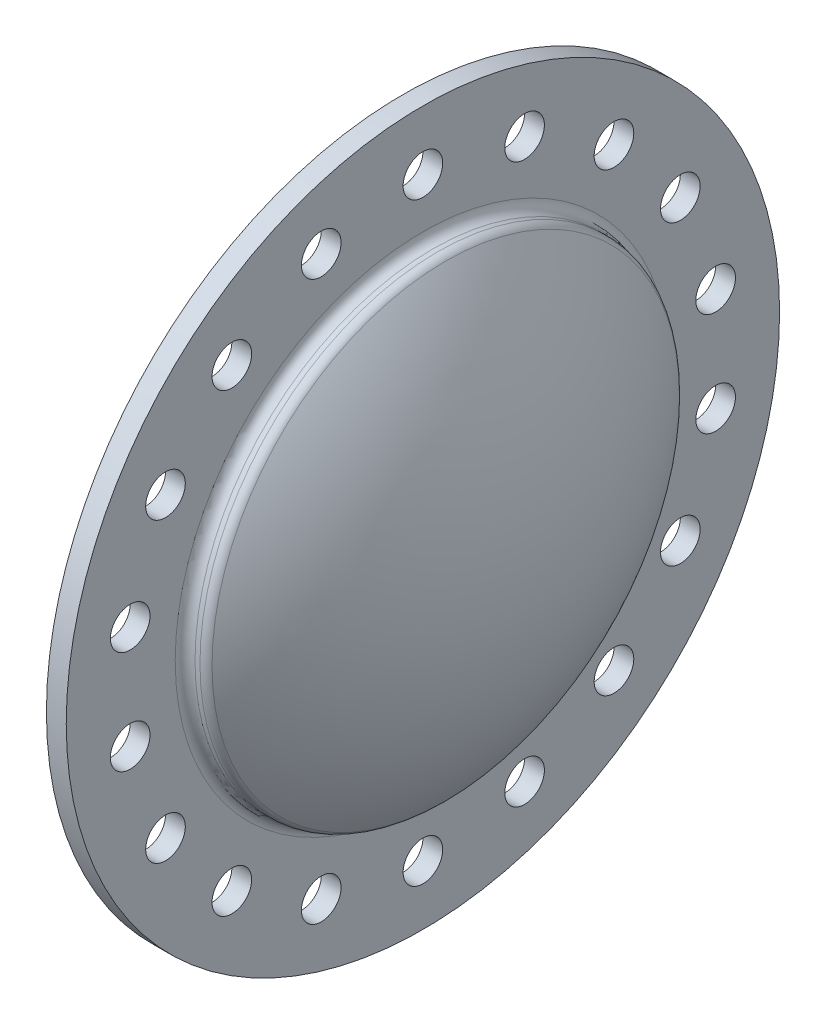
ISO-10303-21;
HEADER;
FILE_DESCRIPTION(('STEP AP214'),'2;1');
FILE_NAME('part.step','',(''),(''),'','','');
FILE_SCHEMA(('AUTOMOTIVE_DESIGN { 1 0 10303 214 1 1 1 1 }'));
ENDSEC;
DATA;
#1=APPLICATION_CONTEXT('core data for automotive mechanical design processes');
#2=APPLICATION_PROTOCOL_DEFINITION('international standard','automotive_design',2000,#1);
#3=PRODUCT_CONTEXT('',#1,'mechanical');
#4=PRODUCT('Part','Part','',(#3));
#5=PRODUCT_RELATED_PRODUCT_CATEGORY('part','',(#4));
#6=PRODUCT_DEFINITION_FORMATION('','',#4);
#7=PRODUCT_DEFINITION_CONTEXT('part definition',#1,'design');
#8=PRODUCT_DEFINITION('design','',#6,#7);
#9=PRODUCT_DEFINITION_SHAPE('','',#8);
#10=(LENGTH_UNIT() NAMED_UNIT(*) SI_UNIT(.MILLI.,.METRE.));
#11=(NAMED_UNIT(*) PLANE_ANGLE_UNIT() SI_UNIT($,.RADIAN.));
#12=(NAMED_UNIT(*) SI_UNIT($,.STERADIAN.) SOLID_ANGLE_UNIT());
#13=UNCERTAINTY_MEASURE_WITH_UNIT(LENGTH_MEASURE(1.E-05),#10,'distance_accuracy_value','');
#14=(GEOMETRIC_REPRESENTATION_CONTEXT(3) GLOBAL_UNCERTAINTY_ASSIGNED_CONTEXT((#13)) GLOBAL_UNIT_ASSIGNED_CONTEXT((#10,
#11,#12)) REPRESENTATION_CONTEXT('',''));
#15=CARTESIAN_POINT('',(0.,0.,0.));
#16=DIRECTION('',(0.,0.,1.));
#17=DIRECTION('',(1.,0.,0.));
#18=AXIS2_PLACEMENT_3D('',#15,#16,#17);
#19=CARTESIAN_POINT('',(5.,0.,0.));
#20=DIRECTION('',(1.,0.,0.));
#21=DIRECTION('',(0.,0.,-1.));
#22=AXIS2_PLACEMENT_3D('',#19,#20,#21);
#23=PLANE('',#22);
#24=CARTESIAN_POINT('',(5.,0.,0.));
#25=DIRECTION('',(1.,0.,0.));
#26=DIRECTION('',(0.,0.,-1.));
#27=AXIS2_PLACEMENT_3D('',#24,#25,#26);
#28=CIRCLE('',#27,62.5);
#29=CARTESIAN_POINT('',(5.,0.,-62.5));
#30=VERTEX_POINT('',#29);
#31=EDGE_CURVE('E10',#30,#30,#28,.F.);
#32=ORIENTED_EDGE('',*,*,#31,.T.);
#33=EDGE_LOOP('',(#32));
#34=FACE_BOUND('',#33,.T.);
#35=CARTESIAN_POINT('',(5.,57.4526904463122,48.2088367709321));
#36=DIRECTION('',(1.,0.,0.));
#37=DIRECTION('',(0.,0.,-1.));
#38=AXIS2_PLACEMENT_3D('',#35,#36,#37);
#39=CIRCLE('',#38,5.);
#40=CARTESIAN_POINT('',(5.,57.4526904463122,43.2088367709321));
#41=VERTEX_POINT('',#40);
#42=EDGE_CURVE('E151',#41,#41,#39,.T.);
#43=ORIENTED_EDGE('',*,*,#42,.F.);
#44=EDGE_LOOP('',(#43));
#45=FACE_BOUND('',#44,.T.);
#46=CARTESIAN_POINT('',(5.,13.0226285172644,73.8597551240905));
#47=DIRECTION('',(1.,0.,0.));
#48=DIRECTION('',(0.,0.,-1.));
#49=AXIS2_PLACEMENT_3D('',#46,#47,#48);
#50=CIRCLE('',#49,5.);
#51=CARTESIAN_POINT('',(5.,13.0226285172644,68.8597551240905));
#52=VERTEX_POINT('',#51);
#53=EDGE_CURVE('E139',#52,#52,#50,.T.);
#54=ORIENTED_EDGE('',*,*,#53,.F.);
#55=EDGE_LOOP('',(#54));
#56=FACE_BOUND('',#55,.T.);
#57=CARTESIAN_POINT('',(5.,-37.5008660254059,64.9504052838285));
#58=DIRECTION('',(1.,0.,0.));
#59=DIRECTION('',(0.,0.,-1.));
#60=AXIS2_PLACEMENT_3D('',#57,#58,#59);
#61=CIRCLE('',#60,5.00000000000001);
#62=CARTESIAN_POINT('',(5.,-37.5008660254059,59.9504052838285));
#63=VERTEX_POINT('',#62);
#64=EDGE_CURVE('E127',#63,#63,#61,.T.);
#65=ORIENTED_EDGE('',*,*,#64,.F.);
#66=EDGE_LOOP('',(#65));
#67=FACE_BOUND('',#66,.T.);
#68=CARTESIAN_POINT('',(5.,-70.4772885790873,25.6495710567987));
#69=DIRECTION('',(1.,0.,0.));
#70=DIRECTION('',(0.,0.,-1.));
#71=AXIS2_PLACEMENT_3D('',#68,#69,#70);
#72=CIRCLE('',#71,5.);
#73=CARTESIAN_POINT('',(5.,-70.4772885790873,20.6495710567987));
#74=VERTEX_POINT('',#73);
#75=EDGE_CURVE('E115',#74,#74,#72,.T.);
#76=ORIENTED_EDGE('',*,*,#75,.F.);
#77=EDGE_LOOP('',(#76));
#78=FACE_BOUND('',#77,.T.);
#79=CARTESIAN_POINT('',(5.,-70.4766045387989,-25.6534504420517));
#80=DIRECTION('',(1.,0.,0.));
#81=DIRECTION('',(0.,0.,-1.));
#82=AXIS2_PLACEMENT_3D('',#79,#80,#81);
#83=CIRCLE('',#82,5.);
#84=CARTESIAN_POINT('',(5.,-70.4766045387989,-30.6534504420517));
#85=VERTEX_POINT('',#84);
#86=EDGE_CURVE('E103',#85,#85,#83,.T.);
#87=ORIENTED_EDGE('',*,*,#86,.F.);
#88=EDGE_LOOP('',(#87));
#89=FACE_BOUND('',#88,.T.);
#90=CARTESIAN_POINT('',(5.,-37.4991339745938,-64.9534052838375));
#91=DIRECTION('',(1.,0.,0.));
#92=DIRECTION('',(0.,0.,-1.));
#93=AXIS2_PLACEMENT_3D('',#90,#91,#92);
#94=CIRCLE('',#93,5.);
#95=CARTESIAN_POINT('',(5.,-37.4991339745938,-69.9534052838375));
#96=VERTEX_POINT('',#95);
#97=EDGE_CURVE('E91',#96,#96,#94,.T.);
#98=ORIENTED_EDGE('',*,*,#97,.F.);
#99=EDGE_LOOP('',(#98));
#100=FACE_BOUND('',#99,.T.);
#101=CARTESIAN_POINT('',(5.,13.0245981327757,-73.8614078277406));
#102=DIRECTION('',(1.,0.,0.));
#103=DIRECTION('',(0.,0.,-1.));
#104=AXIS2_PLACEMENT_3D('',#101,#102,#103);
#105=CIRCLE('',#104,5.);
#106=CARTESIAN_POINT('',(5.,13.0245981327757,-78.8614078277406));
#107=VERTEX_POINT('',#106);
#108=EDGE_CURVE('E79',#107,#107,#105,.T.);
#109=ORIENTED_EDGE('',*,*,#108,.F.);
#110=EDGE_LOOP('',(#109));
#111=FACE_BOUND('',#110,.T.);
#112=CARTESIAN_POINT('',(5.,57.453976021535,-48.2093046820482));
#113=DIRECTION('',(1.,0.,0.));
#114=DIRECTION('',(0.,0.,-1.));
#115=AXIS2_PLACEMENT_3D('',#112,#113,#114);
#116=CIRCLE('',#115,5.00000000000001);
#117=CARTESIAN_POINT('',(5.,57.453976021535,-53.2093046820482));
#118=VERTEX_POINT('',#117);
#119=EDGE_CURVE('E67',#118,#118,#116,.T.);
#120=ORIENTED_EDGE('',*,*,#119,.F.);
#121=EDGE_LOOP('',(#120));
#122=FACE_BOUND('',#121,.T.);
#123=CARTESIAN_POINT('',(5.,0.,0.));
#124=DIRECTION('',(1.,0.,0.));
#125=DIRECTION('',(0.,0.,-1.));
#126=AXIS2_PLACEMENT_3D('',#123,#124,#125);
#127=CIRCLE('',#126,90.);
#128=CARTESIAN_POINT('',(5.,0.,-90.));
#129=VERTEX_POINT('',#128);
#130=EDGE_CURVE('E51',#129,#129,#127,.T.);
#131=ORIENTED_EDGE('',*,*,#130,.T.);
#132=EDGE_LOOP('',(#131));
#133=FACE_BOUND('',#132,.T.);
#134=CARTESIAN_POINT('',(5.,75.,0.));
#135=DIRECTION('',(1.,0.,0.));
#136=DIRECTION('',(0.,0.,-1.));
#137=AXIS2_PLACEMENT_3D('',#134,#135,#136);
#138=CIRCLE('',#137,5.);
#139=CARTESIAN_POINT('',(5.,75.,-5.));
#140=VERTEX_POINT('',#139);
#141=EDGE_CURVE('E55',#140,#140,#138,.T.);
#142=ORIENTED_EDGE('',*,*,#141,.F.);
#143=EDGE_LOOP('',(#142));
#144=FACE_BOUND('',#143,.T.);
#145=CARTESIAN_POINT('',(5.,70.4772885790875,-25.6515710568046));
#146=DIRECTION('',(1.,0.,0.));
#147=DIRECTION('',(0.,0.,-1.));
#148=AXIS2_PLACEMENT_3D('',#145,#146,#147);
#149=CIRCLE('',#148,5.);
#150=CARTESIAN_POINT('',(5.,70.4772885790875,-30.6515710568046));
#151=VERTEX_POINT('',#150);
#152=EDGE_CURVE('E61',#151,#151,#149,.T.);
#153=ORIENTED_EDGE('',*,*,#152,.F.);
#154=EDGE_LOOP('',(#153));
#155=FACE_BOUND('',#154,.T.);
#156=CARTESIAN_POINT('',(5.,37.5008660254064,-64.9524052838346));
#157=DIRECTION('',(1.,0.,0.));
#158=DIRECTION('',(0.,0.,-1.));
#159=AXIS2_PLACEMENT_3D('',#156,#157,#158);
#160=CIRCLE('',#159,5.00000000000001);
#161=CARTESIAN_POINT('',(5.,37.5008660254064,-69.9524052838346));
#162=VERTEX_POINT('',#161);
#163=EDGE_CURVE('E73',#162,#162,#160,.T.);
#164=ORIENTED_EDGE('',*,*,#163,.F.);
#165=EDGE_LOOP('',(#164));
#166=FACE_BOUND('',#165,.T.);
#167=CARTESIAN_POINT('',(5.,-13.0226285172639,-73.861755124097));
#168=DIRECTION('',(1.,0.,0.));
#169=DIRECTION('',(0.,0.,-1.));
#170=AXIS2_PLACEMENT_3D('',#167,#168,#169);
#171=CIRCLE('',#170,5.);
#172=CARTESIAN_POINT('',(5.,-13.0226285172639,-78.861755124097));
#173=VERTEX_POINT('',#172);
#174=EDGE_CURVE('E85',#173,#173,#171,.T.);
#175=ORIENTED_EDGE('',*,*,#174,.F.);
#176=EDGE_LOOP('',(#175));
#177=FACE_BOUND('',#176,.T.);
#178=CARTESIAN_POINT('',(5.,-57.4526904463119,-48.2108367709389));
#179=DIRECTION('',(1.,0.,0.));
#180=DIRECTION('',(0.,0.,-1.));
#181=AXIS2_PLACEMENT_3D('',#178,#179,#180);
#182=CIRCLE('',#181,5.);
#183=CARTESIAN_POINT('',(5.,-57.4526904463119,-53.2108367709389));
#184=VERTEX_POINT('',#183);
#185=EDGE_CURVE('E97',#184,#184,#182,.T.);
#186=ORIENTED_EDGE('',*,*,#185,.F.);
#187=EDGE_LOOP('',(#186));
#188=FACE_BOUND('',#187,.T.);
#189=CARTESIAN_POINT('',(5.,-75.,-0.002000000005842));
#190=DIRECTION('',(1.,0.,0.));
#191=DIRECTION('',(0.,0.,-1.));
#192=AXIS2_PLACEMENT_3D('',#189,#190,#191);
#193=CIRCLE('',#192,5.);
#194=CARTESIAN_POINT('',(5.,-75.,-5.00200000000584));
#195=VERTEX_POINT('',#194);
#196=EDGE_CURVE('E109',#195,#195,#193,.T.);
#197=ORIENTED_EDGE('',*,*,#196,.F.);
#198=EDGE_LOOP('',(#197));
#199=FACE_BOUND('',#198,.T.);
#200=CARTESIAN_POINT('',(5.,-57.4539760215347,48.2073046820422));
#201=DIRECTION('',(1.,0.,0.));
#202=DIRECTION('',(0.,0.,-1.));
#203=AXIS2_PLACEMENT_3D('',#200,#201,#202);
#204=CIRCLE('',#203,5.);
#205=CARTESIAN_POINT('',(5.,-57.4539760215347,43.2073046820422));
#206=VERTEX_POINT('',#205);
#207=EDGE_CURVE('E121',#206,#206,#204,.T.);
#208=ORIENTED_EDGE('',*,*,#207,.F.);
#209=EDGE_LOOP('',(#208));
#210=FACE_BOUND('',#209,.T.);
#211=CARTESIAN_POINT('',(5.,-13.0245981327752,73.8594078277343));
#212=DIRECTION('',(1.,0.,0.));
#213=DIRECTION('',(0.,0.,-1.));
#214=AXIS2_PLACEMENT_3D('',#211,#212,#213);
#215=CIRCLE('',#214,5.);
#216=CARTESIAN_POINT('',(5.,-13.0245981327752,68.8594078277343));
#217=VERTEX_POINT('',#216);
#218=EDGE_CURVE('E133',#217,#217,#215,.T.);
#219=ORIENTED_EDGE('',*,*,#218,.F.);
#220=EDGE_LOOP('',(#219));
#221=FACE_BOUND('',#220,.T.);
#222=CARTESIAN_POINT('',(5.,37.4991339745942,64.9514052838309));
#223=DIRECTION('',(1.,0.,0.));
#224=DIRECTION('',(0.,0.,-1.));
#225=AXIS2_PLACEMENT_3D('',#222,#223,#224);
#226=CIRCLE('',#225,5.00000000000001);
#227=CARTESIAN_POINT('',(5.,37.4991339745942,59.9514052838309));
#228=VERTEX_POINT('',#227);
#229=EDGE_CURVE('E145',#228,#228,#226,.T.);
#230=ORIENTED_EDGE('',*,*,#229,.F.);
#231=EDGE_LOOP('',(#230));
#232=FACE_BOUND('',#231,.T.);
#233=CARTESIAN_POINT('',(5.,70.4766045387991,25.6514504420449));
#234=DIRECTION('',(1.,0.,0.));
#235=DIRECTION('',(0.,0.,-1.));
#236=AXIS2_PLACEMENT_3D('',#233,#234,#235);
#237=CIRCLE('',#236,5.00000000000001);
#238=CARTESIAN_POINT('',(5.,70.4766045387991,20.6514504420449));
#239=VERTEX_POINT('',#238);
#240=EDGE_CURVE('E157',#239,#239,#237,.T.);
#241=ORIENTED_EDGE('',*,*,#240,.F.);
#242=EDGE_LOOP('',(#241));
#243=FACE_BOUND('',#242,.T.);
#244=ADVANCED_FACE('F31',(#34,#45,#56,#67,#78,#89,#100,#111,#122,#133,#144,#155,#166,#177,#188,
#199,#210,#221,#232,#243),#23,.T.);
#245=CARTESIAN_POINT('',(0.,0.,0.));
#246=DIRECTION('',(1.,0.,0.));
#247=DIRECTION('',(0.,0.,-1.));
#248=AXIS2_PLACEMENT_3D('',#245,#246,#247);
#249=PLANE('',#248);
#250=CARTESIAN_POINT('',(0.,0.,0.));
#251=DIRECTION('',(1.,0.,0.));
#252=DIRECTION('',(0.,0.,-1.));
#253=AXIS2_PLACEMENT_3D('',#250,#251,#252);
#254=CIRCLE('',#253,90.);
#255=CARTESIAN_POINT('',(0.,0.,-90.));
#256=VERTEX_POINT('',#255);
#257=EDGE_CURVE('E52',#256,#256,#254,.T.);
#258=ORIENTED_EDGE('',*,*,#257,.F.);
#259=EDGE_LOOP('',(#258));
#260=FACE_BOUND('',#259,.T.);
#261=CARTESIAN_POINT('',(0.,75.,0.));
#262=DIRECTION('',(1.,0.,0.));
#263=DIRECTION('',(0.,0.,-1.));
#264=AXIS2_PLACEMENT_3D('',#261,#262,#263);
#265=CIRCLE('',#264,5.);
#266=CARTESIAN_POINT('',(0.,75.,-5.));
#267=VERTEX_POINT('',#266);
#268=EDGE_CURVE('E58',#267,#267,#265,.T.);
#269=ORIENTED_EDGE('',*,*,#268,.T.);
#270=EDGE_LOOP('',(#269));
#271=FACE_BOUND('',#270,.T.);
#272=CARTESIAN_POINT('',(0.,70.4772885790875,-25.6515710568046));
#273=DIRECTION('',(1.,0.,0.));
#274=DIRECTION('',(0.,0.,-1.));
#275=AXIS2_PLACEMENT_3D('',#272,#273,#274);
#276=CIRCLE('',#275,5.);
#277=CARTESIAN_POINT('',(0.,70.4772885790875,-30.6515710568046));
#278=VERTEX_POINT('',#277);
#279=EDGE_CURVE('E64',#278,#278,#276,.T.);
#280=ORIENTED_EDGE('',*,*,#279,.T.);
#281=EDGE_LOOP('',(#280));
#282=FACE_BOUND('',#281,.T.);
#283=CARTESIAN_POINT('',(0.,57.453976021535,-48.2093046820482));
#284=DIRECTION('',(1.,0.,0.));
#285=DIRECTION('',(0.,0.,-1.));
#286=AXIS2_PLACEMENT_3D('',#283,#284,#285);
#287=CIRCLE('',#286,5.00000000000001);
#288=CARTESIAN_POINT('',(0.,57.453976021535,-53.2093046820482));
#289=VERTEX_POINT('',#288);
#290=EDGE_CURVE('E70',#289,#289,#287,.T.);
#291=ORIENTED_EDGE('',*,*,#290,.T.);
#292=EDGE_LOOP('',(#291));
#293=FACE_BOUND('',#292,.T.);
#294=CARTESIAN_POINT('',(0.,37.5008660254064,-64.9524052838346));
#295=DIRECTION('',(1.,0.,0.));
#296=DIRECTION('',(0.,0.,-1.));
#297=AXIS2_PLACEMENT_3D('',#294,#295,#296);
#298=CIRCLE('',#297,5.00000000000001);
#299=CARTESIAN_POINT('',(0.,37.5008660254064,-69.9524052838346));
#300=VERTEX_POINT('',#299);
#301=EDGE_CURVE('E76',#300,#300,#298,.T.);
#302=ORIENTED_EDGE('',*,*,#301,.T.);
#303=EDGE_LOOP('',(#302));
#304=FACE_BOUND('',#303,.T.);
#305=CARTESIAN_POINT('',(0.,13.0245981327757,-73.8614078277406));
#306=DIRECTION('',(1.,0.,0.));
#307=DIRECTION('',(0.,0.,-1.));
#308=AXIS2_PLACEMENT_3D('',#305,#306,#307);
#309=CIRCLE('',#308,5.);
#310=CARTESIAN_POINT('',(0.,13.0245981327757,-78.8614078277406));
#311=VERTEX_POINT('',#310);
#312=EDGE_CURVE('E82',#311,#311,#309,.T.);
#313=ORIENTED_EDGE('',*,*,#312,.T.);
#314=EDGE_LOOP('',(#313));
#315=FACE_BOUND('',#314,.T.);
#316=CARTESIAN_POINT('',(0.,-13.0226285172639,-73.861755124097));
#317=DIRECTION('',(1.,0.,0.));
#318=DIRECTION('',(0.,0.,-1.));
#319=AXIS2_PLACEMENT_3D('',#316,#317,#318);
#320=CIRCLE('',#319,5.);
#321=CARTESIAN_POINT('',(0.,-13.0226285172639,-78.861755124097));
#322=VERTEX_POINT('',#321);
#323=EDGE_CURVE('E88',#322,#322,#320,.T.);
#324=ORIENTED_EDGE('',*,*,#323,.T.);
#325=EDGE_LOOP('',(#324));
#326=FACE_BOUND('',#325,.T.);
#327=CARTESIAN_POINT('',(0.,-37.4991339745938,-64.9534052838375));
#328=DIRECTION('',(1.,0.,0.));
#329=DIRECTION('',(0.,0.,-1.));
#330=AXIS2_PLACEMENT_3D('',#327,#328,#329);
#331=CIRCLE('',#330,5.);
#332=CARTESIAN_POINT('',(0.,-37.4991339745938,-69.9534052838375));
#333=VERTEX_POINT('',#332);
#334=EDGE_CURVE('E94',#333,#333,#331,.T.);
#335=ORIENTED_EDGE('',*,*,#334,.T.);
#336=EDGE_LOOP('',(#335));
#337=FACE_BOUND('',#336,.T.);
#338=CARTESIAN_POINT('',(0.,-57.4526904463119,-48.2108367709389));
#339=DIRECTION('',(1.,0.,0.));
#340=DIRECTION('',(0.,0.,-1.));
#341=AXIS2_PLACEMENT_3D('',#338,#339,#340);
#342=CIRCLE('',#341,5.);
#343=CARTESIAN_POINT('',(0.,-57.4526904463119,-53.2108367709389));
#344=VERTEX_POINT('',#343);
#345=EDGE_CURVE('E100',#344,#344,#342,.T.);
#346=ORIENTED_EDGE('',*,*,#345,.T.);
#347=EDGE_LOOP('',(#346));
#348=FACE_BOUND('',#347,.T.);
#349=CARTESIAN_POINT('',(0.,-70.4766045387989,-25.6534504420517));
#350=DIRECTION('',(1.,0.,0.));
#351=DIRECTION('',(0.,0.,-1.));
#352=AXIS2_PLACEMENT_3D('',#349,#350,#351);
#353=CIRCLE('',#352,5.);
#354=CARTESIAN_POINT('',(0.,-70.4766045387989,-30.6534504420517));
#355=VERTEX_POINT('',#354);
#356=EDGE_CURVE('E106',#355,#355,#353,.T.);
#357=ORIENTED_EDGE('',*,*,#356,.T.);
#358=EDGE_LOOP('',(#357));
#359=FACE_BOUND('',#358,.T.);
#360=CARTESIAN_POINT('',(0.,-75.,-0.002000000005842));
#361=DIRECTION('',(1.,0.,0.));
#362=DIRECTION('',(0.,0.,-1.));
#363=AXIS2_PLACEMENT_3D('',#360,#361,#362);
#364=CIRCLE('',#363,5.);
#365=CARTESIAN_POINT('',(0.,-75.,-5.00200000000584));
#366=VERTEX_POINT('',#365);
#367=EDGE_CURVE('E112',#366,#366,#364,.T.);
#368=ORIENTED_EDGE('',*,*,#367,.T.);
#369=EDGE_LOOP('',(#368));
#370=FACE_BOUND('',#369,.T.);
#371=CARTESIAN_POINT('',(0.,-70.4772885790873,25.6495710567987));
#372=DIRECTION('',(1.,0.,0.));
#373=DIRECTION('',(0.,0.,-1.));
#374=AXIS2_PLACEMENT_3D('',#371,#372,#373);
#375=CIRCLE('',#374,5.);
#376=CARTESIAN_POINT('',(0.,-70.4772885790873,20.6495710567987));
#377=VERTEX_POINT('',#376);
#378=EDGE_CURVE('E118',#377,#377,#375,.T.);
#379=ORIENTED_EDGE('',*,*,#378,.T.);
#380=EDGE_LOOP('',(#379));
#381=FACE_BOUND('',#380,.T.);
#382=CARTESIAN_POINT('',(0.,-57.4539760215347,48.2073046820422));
#383=DIRECTION('',(1.,0.,0.));
#384=DIRECTION('',(0.,0.,-1.));
#385=AXIS2_PLACEMENT_3D('',#382,#383,#384);
#386=CIRCLE('',#385,5.);
#387=CARTESIAN_POINT('',(0.,-57.4539760215347,43.2073046820422));
#388=VERTEX_POINT('',#387);
#389=EDGE_CURVE('E124',#388,#388,#386,.T.);
#390=ORIENTED_EDGE('',*,*,#389,.T.);
#391=EDGE_LOOP('',(#390));
#392=FACE_BOUND('',#391,.T.);
#393=CARTESIAN_POINT('',(0.,-37.5008660254059,64.9504052838285));
#394=DIRECTION('',(1.,0.,0.));
#395=DIRECTION('',(0.,0.,-1.));
#396=AXIS2_PLACEMENT_3D('',#393,#394,#395);
#397=CIRCLE('',#396,5.00000000000001);
#398=CARTESIAN_POINT('',(0.,-37.5008660254059,59.9504052838285));
#399=VERTEX_POINT('',#398);
#400=EDGE_CURVE('E130',#399,#399,#397,.T.);
#401=ORIENTED_EDGE('',*,*,#400,.T.);
#402=EDGE_LOOP('',(#401));
#403=FACE_BOUND('',#402,.T.);
#404=CARTESIAN_POINT('',(0.,-13.0245981327752,73.8594078277343));
#405=DIRECTION('',(1.,0.,0.));
#406=DIRECTION('',(0.,0.,-1.));
#407=AXIS2_PLACEMENT_3D('',#404,#405,#406);
#408=CIRCLE('',#407,5.);
#409=CARTESIAN_POINT('',(0.,-13.0245981327752,68.8594078277343));
#410=VERTEX_POINT('',#409);
#411=EDGE_CURVE('E136',#410,#410,#408,.T.);
#412=ORIENTED_EDGE('',*,*,#411,.T.);
#413=EDGE_LOOP('',(#412));
#414=FACE_BOUND('',#413,.T.);
#415=CARTESIAN_POINT('',(0.,13.0226285172644,73.8597551240905));
#416=DIRECTION('',(1.,0.,0.));
#417=DIRECTION('',(0.,0.,-1.));
#418=AXIS2_PLACEMENT_3D('',#415,#416,#417);
#419=CIRCLE('',#418,5.);
#420=CARTESIAN_POINT('',(0.,13.0226285172644,68.8597551240905));
#421=VERTEX_POINT('',#420);
#422=EDGE_CURVE('E142',#421,#421,#419,.T.);
#423=ORIENTED_EDGE('',*,*,#422,.T.);
#424=EDGE_LOOP('',(#423));
#425=FACE_BOUND('',#424,.T.);
#426=CARTESIAN_POINT('',(0.,37.4991339745942,64.9514052838309));
#427=DIRECTION('',(1.,0.,0.));
#428=DIRECTION('',(0.,0.,-1.));
#429=AXIS2_PLACEMENT_3D('',#426,#427,#428);
#430=CIRCLE('',#429,5.00000000000001);
#431=CARTESIAN_POINT('',(0.,37.4991339745942,59.9514052838309));
#432=VERTEX_POINT('',#431);
#433=EDGE_CURVE('E148',#432,#432,#430,.T.);
#434=ORIENTED_EDGE('',*,*,#433,.T.);
#435=EDGE_LOOP('',(#434));
#436=FACE_BOUND('',#435,.T.);
#437=CARTESIAN_POINT('',(0.,57.4526904463122,48.2088367709321));
#438=DIRECTION('',(1.,0.,0.));
#439=DIRECTION('',(0.,0.,-1.));
#440=AXIS2_PLACEMENT_3D('',#437,#438,#439);
#441=CIRCLE('',#440,5.);
#442=CARTESIAN_POINT('',(0.,57.4526904463122,43.2088367709321));
#443=VERTEX_POINT('',#442);
#444=EDGE_CURVE('E154',#443,#443,#441,.T.);
#445=ORIENTED_EDGE('',*,*,#444,.T.);
#446=EDGE_LOOP('',(#445));
#447=FACE_BOUND('',#446,.T.);
#448=CARTESIAN_POINT('',(0.,70.4766045387991,25.6514504420449));
#449=DIRECTION('',(1.,0.,0.));
#450=DIRECTION('',(0.,0.,-1.));
#451=AXIS2_PLACEMENT_3D('',#448,#449,#450);
#452=CIRCLE('',#451,5.00000000000001);
#453=CARTESIAN_POINT('',(0.,70.4766045387991,20.6514504420449));
#454=VERTEX_POINT('',#453);
#455=EDGE_CURVE('E160',#454,#454,#452,.T.);
#456=ORIENTED_EDGE('',*,*,#455,.T.);
#457=EDGE_LOOP('',(#456));
#458=FACE_BOUND('',#457,.T.);
#459=ADVANCED_FACE('F170',(#260,#271,#282,#293,#304,#315,#326,#337,#348,#359,#370,#381,#392,
#403,#414,#425,#436,#447,#458),#249,.F.);
#460=CARTESIAN_POINT('',(5.,0.,0.));
#461=DIRECTION('',(-1.,0.,0.));
#462=DIRECTION('',(0.,0.,1.));
#463=AXIS2_PLACEMENT_3D('',#460,#461,#462);
#464=CYLINDRICAL_SURFACE('',#463,90.);
#465=ORIENTED_EDGE('',*,*,#130,.F.);
#466=EDGE_LOOP('',(#465));
#467=FACE_BOUND('',#466,.T.);
#468=ORIENTED_EDGE('',*,*,#257,.T.);
#469=EDGE_LOOP('',(#468));
#470=FACE_BOUND('',#469,.T.);
#471=ADVANCED_FACE('F175',(#467,#470),#464,.T.);
#472=CARTESIAN_POINT('',(5.,75.,0.));
#473=DIRECTION('',(-1.,0.,0.));
#474=DIRECTION('',(0.,0.,1.));
#475=AXIS2_PLACEMENT_3D('',#472,#473,#474);
#476=CYLINDRICAL_SURFACE('',#475,5.);
#477=ORIENTED_EDGE('',*,*,#141,.T.);
#478=EDGE_LOOP('',(#477));
#479=FACE_BOUND('',#478,.T.);
#480=ORIENTED_EDGE('',*,*,#268,.F.);
#481=EDGE_LOOP('',(#480));
#482=FACE_BOUND('',#481,.T.);
#483=ADVANCED_FACE('F180',(#479,#482),#476,.F.);
#484=CARTESIAN_POINT('',(5.,70.4772885790875,-25.6515710568046));
#485=DIRECTION('',(-1.,0.,0.));
#486=DIRECTION('',(0.,0.,1.));
#487=AXIS2_PLACEMENT_3D('',#484,#485,#486);
#488=CYLINDRICAL_SURFACE('',#487,5.);
#489=ORIENTED_EDGE('',*,*,#152,.T.);
#490=EDGE_LOOP('',(#489));
#491=FACE_BOUND('',#490,.T.);
#492=ORIENTED_EDGE('',*,*,#279,.F.);
#493=EDGE_LOOP('',(#492));
#494=FACE_BOUND('',#493,.T.);
#495=ADVANCED_FACE('F264',(#491,#494),#488,.F.);
#496=CARTESIAN_POINT('',(5.,57.453976021535,-48.2093046820482));
#497=DIRECTION('',(-1.,0.,0.));
#498=DIRECTION('',(0.,0.,1.));
#499=AXIS2_PLACEMENT_3D('',#496,#497,#498);
#500=CYLINDRICAL_SURFACE('',#499,5.00000000000001);
#501=ORIENTED_EDGE('',*,*,#119,.T.);
#502=EDGE_LOOP('',(#501));
#503=FACE_BOUND('',#502,.T.);
#504=ORIENTED_EDGE('',*,*,#290,.F.);
#505=EDGE_LOOP('',(#504));
#506=FACE_BOUND('',#505,.T.);
#507=ADVANCED_FACE('F261',(#503,#506),#500,.F.);
#508=CARTESIAN_POINT('',(5.,37.5008660254064,-64.9524052838346));
#509=DIRECTION('',(-1.,0.,0.));
#510=DIRECTION('',(0.,0.,1.));
#511=AXIS2_PLACEMENT_3D('',#508,#509,#510);
#512=CYLINDRICAL_SURFACE('',#511,5.00000000000001);
#513=ORIENTED_EDGE('',*,*,#163,.T.);
#514=EDGE_LOOP('',(#513));
#515=FACE_BOUND('',#514,.T.);
#516=ORIENTED_EDGE('',*,*,#301,.F.);
#517=EDGE_LOOP('',(#516));
#518=FACE_BOUND('',#517,.T.);
#519=ADVANCED_FACE('F257',(#515,#518),#512,.F.);
#520=CARTESIAN_POINT('',(5.,13.0245981327757,-73.8614078277406));
#521=DIRECTION('',(-1.,0.,0.));
#522=DIRECTION('',(0.,0.,1.));
#523=AXIS2_PLACEMENT_3D('',#520,#521,#522);
#524=CYLINDRICAL_SURFACE('',#523,5.);
#525=ORIENTED_EDGE('',*,*,#108,.T.);
#526=EDGE_LOOP('',(#525));
#527=FACE_BOUND('',#526,.T.);
#528=ORIENTED_EDGE('',*,*,#312,.F.);
#529=EDGE_LOOP('',(#528));
#530=FACE_BOUND('',#529,.T.);
#531=ADVANCED_FACE('F253',(#527,#530),#524,.F.);
#532=CARTESIAN_POINT('',(5.,-13.0226285172639,-73.861755124097));
#533=DIRECTION('',(-1.,0.,0.));
#534=DIRECTION('',(0.,0.,1.));
#535=AXIS2_PLACEMENT_3D('',#532,#533,#534);
#536=CYLINDRICAL_SURFACE('',#535,5.);
#537=ORIENTED_EDGE('',*,*,#174,.T.);
#538=EDGE_LOOP('',(#537));
#539=FACE_BOUND('',#538,.T.);
#540=ORIENTED_EDGE('',*,*,#323,.F.);
#541=EDGE_LOOP('',(#540));
#542=FACE_BOUND('',#541,.T.);
#543=ADVANCED_FACE('F249',(#539,#542),#536,.F.);
#544=CARTESIAN_POINT('',(5.,-37.4991339745938,-64.9534052838375));
#545=DIRECTION('',(-1.,0.,0.));
#546=DIRECTION('',(0.,0.,1.));
#547=AXIS2_PLACEMENT_3D('',#544,#545,#546);
#548=CYLINDRICAL_SURFACE('',#547,5.);
#549=ORIENTED_EDGE('',*,*,#97,.T.);
#550=EDGE_LOOP('',(#549));
#551=FACE_BOUND('',#550,.T.);
#552=ORIENTED_EDGE('',*,*,#334,.F.);
#553=EDGE_LOOP('',(#552));
#554=FACE_BOUND('',#553,.T.);
#555=ADVANCED_FACE('F245',(#551,#554),#548,.F.);
#556=CARTESIAN_POINT('',(5.,-57.4526904463119,-48.2108367709389));
#557=DIRECTION('',(-1.,0.,0.));
#558=DIRECTION('',(0.,0.,1.));
#559=AXIS2_PLACEMENT_3D('',#556,#557,#558);
#560=CYLINDRICAL_SURFACE('',#559,5.);
#561=ORIENTED_EDGE('',*,*,#185,.T.);
#562=EDGE_LOOP('',(#561));
#563=FACE_BOUND('',#562,.T.);
#564=ORIENTED_EDGE('',*,*,#345,.F.);
#565=EDGE_LOOP('',(#564));
#566=FACE_BOUND('',#565,.T.);
#567=ADVANCED_FACE('F241',(#563,#566),#560,.F.);
#568=CARTESIAN_POINT('',(5.,-70.4766045387989,-25.6534504420517));
#569=DIRECTION('',(-1.,0.,0.));
#570=DIRECTION('',(0.,0.,1.));
#571=AXIS2_PLACEMENT_3D('',#568,#569,#570);
#572=CYLINDRICAL_SURFACE('',#571,5.);
#573=ORIENTED_EDGE('',*,*,#86,.T.);
#574=EDGE_LOOP('',(#573));
#575=FACE_BOUND('',#574,.T.);
#576=ORIENTED_EDGE('',*,*,#356,.F.);
#577=EDGE_LOOP('',(#576));
#578=FACE_BOUND('',#577,.T.);
#579=ADVANCED_FACE('F237',(#575,#578),#572,.F.);
#580=CARTESIAN_POINT('',(5.,-75.,-0.002000000005842));
#581=DIRECTION('',(-1.,0.,0.));
#582=DIRECTION('',(0.,0.,1.));
#583=AXIS2_PLACEMENT_3D('',#580,#581,#582);
#584=CYLINDRICAL_SURFACE('',#583,5.);
#585=ORIENTED_EDGE('',*,*,#196,.T.);
#586=EDGE_LOOP('',(#585));
#587=FACE_BOUND('',#586,.T.);
#588=ORIENTED_EDGE('',*,*,#367,.F.);
#589=EDGE_LOOP('',(#588));
#590=FACE_BOUND('',#589,.T.);
#591=ADVANCED_FACE('F233',(#587,#590),#584,.F.);
#592=CARTESIAN_POINT('',(5.,-70.4772885790873,25.6495710567987));
#593=DIRECTION('',(-1.,0.,0.));
#594=DIRECTION('',(0.,0.,1.));
#595=AXIS2_PLACEMENT_3D('',#592,#593,#594);
#596=CYLINDRICAL_SURFACE('',#595,5.);
#597=ORIENTED_EDGE('',*,*,#75,.T.);
#598=EDGE_LOOP('',(#597));
#599=FACE_BOUND('',#598,.T.);
#600=ORIENTED_EDGE('',*,*,#378,.F.);
#601=EDGE_LOOP('',(#600));
#602=FACE_BOUND('',#601,.T.);
#603=ADVANCED_FACE('F229',(#599,#602),#596,.F.);
#604=CARTESIAN_POINT('',(5.,-57.4539760215347,48.2073046820422));
#605=DIRECTION('',(-1.,0.,0.));
#606=DIRECTION('',(0.,0.,1.));
#607=AXIS2_PLACEMENT_3D('',#604,#605,#606);
#608=CYLINDRICAL_SURFACE('',#607,5.);
#609=ORIENTED_EDGE('',*,*,#207,.T.);
#610=EDGE_LOOP('',(#609));
#611=FACE_BOUND('',#610,.T.);
#612=ORIENTED_EDGE('',*,*,#389,.F.);
#613=EDGE_LOOP('',(#612));
#614=FACE_BOUND('',#613,.T.);
#615=ADVANCED_FACE('F225',(#611,#614),#608,.F.);
#616=CARTESIAN_POINT('',(5.,-37.5008660254059,64.9504052838285));
#617=DIRECTION('',(-1.,0.,0.));
#618=DIRECTION('',(0.,0.,1.));
#619=AXIS2_PLACEMENT_3D('',#616,#617,#618);
#620=CYLINDRICAL_SURFACE('',#619,5.00000000000001);
#621=ORIENTED_EDGE('',*,*,#64,.T.);
#622=EDGE_LOOP('',(#621));
#623=FACE_BOUND('',#622,.T.);
#624=ORIENTED_EDGE('',*,*,#400,.F.);
#625=EDGE_LOOP('',(#624));
#626=FACE_BOUND('',#625,.T.);
#627=ADVANCED_FACE('F221',(#623,#626),#620,.F.);
#628=CARTESIAN_POINT('',(5.,-13.0245981327752,73.8594078277343));
#629=DIRECTION('',(-1.,0.,0.));
#630=DIRECTION('',(0.,0.,1.));
#631=AXIS2_PLACEMENT_3D('',#628,#629,#630);
#632=CYLINDRICAL_SURFACE('',#631,5.);
#633=ORIENTED_EDGE('',*,*,#218,.T.);
#634=EDGE_LOOP('',(#633));
#635=FACE_BOUND('',#634,.T.);
#636=ORIENTED_EDGE('',*,*,#411,.F.);
#637=EDGE_LOOP('',(#636));
#638=FACE_BOUND('',#637,.T.);
#639=ADVANCED_FACE('F217',(#635,#638),#632,.F.);
#640=CARTESIAN_POINT('',(5.,13.0226285172644,73.8597551240905));
#641=DIRECTION('',(-1.,0.,0.));
#642=DIRECTION('',(0.,0.,1.));
#643=AXIS2_PLACEMENT_3D('',#640,#641,#642);
#644=CYLINDRICAL_SURFACE('',#643,5.);
#645=ORIENTED_EDGE('',*,*,#53,.T.);
#646=EDGE_LOOP('',(#645));
#647=FACE_BOUND('',#646,.T.);
#648=ORIENTED_EDGE('',*,*,#422,.F.);
#649=EDGE_LOOP('',(#648));
#650=FACE_BOUND('',#649,.T.);
#651=ADVANCED_FACE('F213',(#647,#650),#644,.F.);
#652=CARTESIAN_POINT('',(5.,37.4991339745942,64.9514052838309));
#653=DIRECTION('',(-1.,0.,0.));
#654=DIRECTION('',(0.,0.,1.));
#655=AXIS2_PLACEMENT_3D('',#652,#653,#654);
#656=CYLINDRICAL_SURFACE('',#655,5.00000000000001);
#657=ORIENTED_EDGE('',*,*,#229,.T.);
#658=EDGE_LOOP('',(#657));
#659=FACE_BOUND('',#658,.T.);
#660=ORIENTED_EDGE('',*,*,#433,.F.);
#661=EDGE_LOOP('',(#660));
#662=FACE_BOUND('',#661,.T.);
#663=ADVANCED_FACE('F209',(#659,#662),#656,.F.);
#664=CARTESIAN_POINT('',(5.,57.4526904463122,48.2088367709321));
#665=DIRECTION('',(-1.,0.,0.));
#666=DIRECTION('',(0.,0.,1.));
#667=AXIS2_PLACEMENT_3D('',#664,#665,#666);
#668=CYLINDRICAL_SURFACE('',#667,5.);
#669=ORIENTED_EDGE('',*,*,#42,.T.);
#670=EDGE_LOOP('',(#669));
#671=FACE_BOUND('',#670,.T.);
#672=ORIENTED_EDGE('',*,*,#444,.F.);
#673=EDGE_LOOP('',(#672));
#674=FACE_BOUND('',#673,.T.);
#675=ADVANCED_FACE('F206',(#671,#674),#668,.F.);
#676=CARTESIAN_POINT('',(5.,70.4766045387991,25.6514504420449));
#677=DIRECTION('',(-1.,0.,0.));
#678=DIRECTION('',(0.,0.,1.));
#679=AXIS2_PLACEMENT_3D('',#676,#677,#678);
#680=CYLINDRICAL_SURFACE('',#679,5.00000000000001);
#681=ORIENTED_EDGE('',*,*,#240,.T.);
#682=EDGE_LOOP('',(#681));
#683=FACE_BOUND('',#682,.T.);
#684=ORIENTED_EDGE('',*,*,#455,.F.);
#685=EDGE_LOOP('',(#684));
#686=FACE_BOUND('',#685,.T.);
#687=ADVANCED_FACE('F166',(#683,#686),#680,.F.);
#688=CARTESIAN_POINT('',(10.,0.,0.));
#689=DIRECTION('',(-1.,0.,0.));
#690=DIRECTION('',(0.,0.,1.));
#691=AXIS2_PLACEMENT_3D('',#688,#689,#690);
#692=CYLINDRICAL_SURFACE('',#691,60.);
#693=CARTESIAN_POINT('',(8.74007874011812,0.,0.));
#694=DIRECTION('',(-1.,0.,0.));
#695=DIRECTION('',(0.,0.,1.));
#696=AXIS2_PLACEMENT_3D('',#693,#694,#695);
#697=CIRCLE('',#696,60.);
#698=CARTESIAN_POINT('',(8.74007874011812,0.,60.));
#699=VERTEX_POINT('',#698);
#700=EDGE_CURVE('E38',#699,#699,#697,.T.);
#701=ORIENTED_EDGE('',*,*,#700,.T.);
#702=EDGE_LOOP('',(#701));
#703=FACE_BOUND('',#702,.T.);
#704=CARTESIAN_POINT('',(7.5,0.,0.));
#705=DIRECTION('',(1.,0.,0.));
#706=DIRECTION('',(0.,0.,-1.));
#707=AXIS2_PLACEMENT_3D('',#704,#705,#706);
#708=CIRCLE('',#707,60.);
#709=CARTESIAN_POINT('',(7.5,0.,-60.));
#710=VERTEX_POINT('',#709);
#711=EDGE_CURVE('E42',#710,#710,#708,.T.);
#712=ORIENTED_EDGE('',*,*,#711,.T.);
#713=EDGE_LOOP('',(#712));
#714=FACE_BOUND('',#713,.T.);
#715=ADVANCED_FACE('F194',(#703,#714),#692,.T.);
#716=CARTESIAN_POINT('',(-70.,0.,0.));
#717=DIRECTION('',(0.,0.,1.));
#718=DIRECTION('',(1.,0.,0.));
#719=AXIS2_PLACEMENT_3D('',#716,#717,#718);
#720=SPHERICAL_SURFACE('',#719,100.);
#721=CARTESIAN_POINT('',(-70.,0.,0.));
#722=DIRECTION('',(-1.,0.,0.));
#723=DIRECTION('',(0.,0.,1.));
#724=AXIS2_PLACEMENT_3D('',#721,#722,#723);
#725=SPHERICAL_SURFACE('',#724,100.);
#726=CARTESIAN_POINT('',(10.7590551180699,0.,0.));
#727=DIRECTION('',(-1.,0.,0.));
#728=DIRECTION('',(0.,0.,1.));
#729=AXIS2_PLACEMENT_3D('',#726,#727,#728);
#730=CIRCLE('',#729,58.974358974359);
#731=CARTESIAN_POINT('',(10.7590551180699,0.,58.974358974359));
#732=VERTEX_POINT('',#731);
#733=EDGE_CURVE('E46',#732,#732,#730,.F.);
#734=ORIENTED_EDGE('',*,*,#733,.T.);
#735=EDGE_LOOP('',(#734));
#736=FACE_BOUND('',#735,.T.);
#737=ADVANCED_FACE('F187',(#736),#725,.T.);
#738=CARTESIAN_POINT('',(8.74007874011812,0.,0.));
#739=DIRECTION('',(-1.,0.,0.));
#740=DIRECTION('',(0.,0.,1.));
#741=AXIS2_PLACEMENT_3D('',#738,#739,#740);
#742=TOROIDAL_SURFACE('',#741,57.5,2.5);
#743=ORIENTED_EDGE('',*,*,#700,.F.);
#744=EDGE_LOOP('',(#743));
#745=FACE_BOUND('',#744,.T.);
#746=ORIENTED_EDGE('',*,*,#733,.F.);
#747=EDGE_LOOP('',(#746));
#748=FACE_BOUND('',#747,.T.);
#749=ADVANCED_FACE('F185',(#745,#748),#742,.T.);
#750=CARTESIAN_POINT('',(7.5,0.,0.));
#751=DIRECTION('',(1.,0.,0.));
#752=DIRECTION('',(0.,0.,-1.));
#753=AXIS2_PLACEMENT_3D('',#750,#751,#752);
#754=TOROIDAL_SURFACE('',#753,62.5,2.5);
#755=ORIENTED_EDGE('',*,*,#31,.F.);
#756=EDGE_LOOP('',(#755));
#757=FACE_BOUND('',#756,.T.);
#758=ORIENTED_EDGE('',*,*,#711,.F.);
#759=EDGE_LOOP('',(#758));
#760=FACE_BOUND('',#759,.T.);
#761=ADVANCED_FACE('F33',(#757,#760),#754,.F.);
#762=CLOSED_SHELL('',(#244,#459,#471,#483,#495,#507,#519,#531,#543,#555,#567,#579,#591,#603,
#615,#627,#639,#651,#663,#675,#687,#715,#737,#749,#761));
#763=MANIFOLD_SOLID_BREP('B2',#762);
#764=ADVANCED_BREP_SHAPE_REPRESENTATION('',(#18,#763),#14);
#765=SHAPE_DEFINITION_REPRESENTATION(#9,#764);
ENDSEC;
END-ISO-10303-21;
